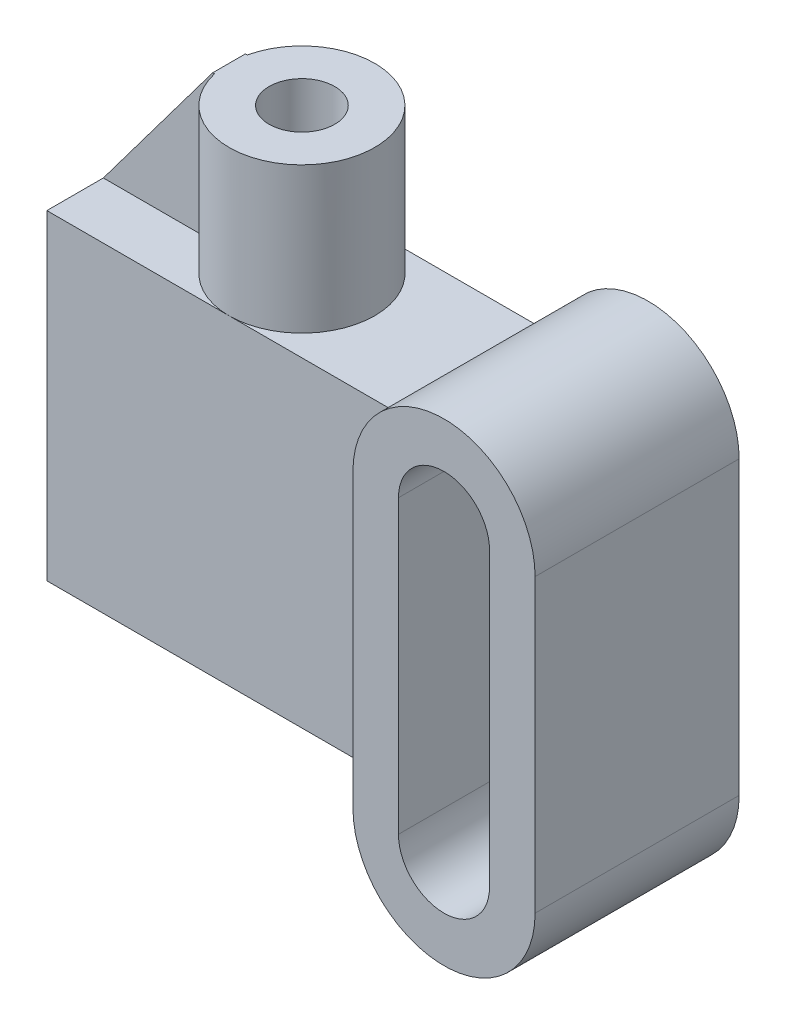
ISO-10303-21;
HEADER;
FILE_DESCRIPTION(('STEP AP214'),'2;1');
FILE_NAME('part.step','',(''),(''),'','','');
FILE_SCHEMA(('AUTOMOTIVE_DESIGN { 1 0 10303 214 1 1 1 1 }'));
ENDSEC;
DATA;
#1=APPLICATION_CONTEXT('core data for automotive mechanical design processes');
#2=APPLICATION_PROTOCOL_DEFINITION('international standard','automotive_design',2000,#1);
#3=PRODUCT_CONTEXT('',#1,'mechanical');
#4=PRODUCT('Part','Part','',(#3));
#5=PRODUCT_RELATED_PRODUCT_CATEGORY('part','',(#4));
#6=PRODUCT_DEFINITION_FORMATION('','',#4);
#7=PRODUCT_DEFINITION_CONTEXT('part definition',#1,'design');
#8=PRODUCT_DEFINITION('design','',#6,#7);
#9=PRODUCT_DEFINITION_SHAPE('','',#8);
#10=(LENGTH_UNIT() NAMED_UNIT(*) SI_UNIT(.MILLI.,.METRE.));
#11=(NAMED_UNIT(*) PLANE_ANGLE_UNIT() SI_UNIT($,.RADIAN.));
#12=(NAMED_UNIT(*) SI_UNIT($,.STERADIAN.) SOLID_ANGLE_UNIT());
#13=UNCERTAINTY_MEASURE_WITH_UNIT(LENGTH_MEASURE(1.E-05),#10,'distance_accuracy_value','');
#14=(GEOMETRIC_REPRESENTATION_CONTEXT(3) GLOBAL_UNCERTAINTY_ASSIGNED_CONTEXT((#13)) GLOBAL_UNIT_ASSIGNED_CONTEXT((#10,
#11,#12)) REPRESENTATION_CONTEXT('',''));
#15=CARTESIAN_POINT('',(0.,0.,0.));
#16=DIRECTION('',(0.,0.,1.));
#17=DIRECTION('',(1.,0.,0.));
#18=AXIS2_PLACEMENT_3D('',#15,#16,#17);
#19=CARTESIAN_POINT('',(-125.,44.,0.));
#20=DIRECTION('',(0.,-1.,0.));
#21=DIRECTION('',(0.,0.,-1.));
#22=AXIS2_PLACEMENT_3D('',#19,#20,#21);
#23=PLANE('',#22);
#24=DIRECTION('',(-1.,0.,0.));
#25=VECTOR('',#24,1.);
#26=CARTESIAN_POINT('',(-125.,44.,15.5));
#27=LINE('',#26,#25);
#28=CARTESIAN_POINT('',(-94.4871752699051,44.,15.5));
#29=VERTEX_POINT('',#28);
#30=CARTESIAN_POINT('',(-125.,44.,15.5));
#31=VERTEX_POINT('',#30);
#32=EDGE_CURVE('E221',#29,#31,#27,.T.);
#33=ORIENTED_EDGE('',*,*,#32,.F.);
#34=CARTESIAN_POINT('',(-75.,44.,20.));
#35=DIRECTION('',(0.,-1.,0.));
#36=DIRECTION('',(0.,0.,-1.));
#37=AXIS2_PLACEMENT_3D('',#34,#35,#36);
#38=CIRCLE('',#37,20.);
#39=CARTESIAN_POINT('',(-75.,44.,0.));
#40=VERTEX_POINT('',#39);
#41=EDGE_CURVE('E11',#40,#29,#38,.F.);
#42=ORIENTED_EDGE('',*,*,#41,.F.);
#43=DIRECTION('',(1.,0.,0.));
#44=VECTOR('',#43,1.);
#45=CARTESIAN_POINT('',(-125.,44.,0.));
#46=LINE('',#45,#44);
#47=CARTESIAN_POINT('',(-125.,44.,0.));
#48=VERTEX_POINT('',#47);
#49=EDGE_CURVE('E353',#48,#40,#46,.T.);
#50=ORIENTED_EDGE('',*,*,#49,.F.);
#51=DIRECTION('',(0.,0.,-1.));
#52=VECTOR('',#51,1.);
#53=CARTESIAN_POINT('',(-125.,44.,0.));
#54=LINE('',#53,#52);
#55=EDGE_CURVE('E305',#31,#48,#54,.T.);
#56=ORIENTED_EDGE('',*,*,#55,.F.);
#57=EDGE_LOOP('',(#33,#42,#50,#56));
#58=FACE_BOUND('',#57,.T.);
#59=ADVANCED_FACE('F43',(#58),#23,.F.);
#60=CARTESIAN_POINT('',(-94.4871752699051,44.,24.5));
#61=VERTEX_POINT('',#60);
#62=CARTESIAN_POINT('',(-75.,44.,40.));
#63=VERTEX_POINT('',#62);
#64=EDGE_CURVE('E52',#61,#63,#38,.F.);
#65=ORIENTED_EDGE('',*,*,#64,.F.);
#66=DIRECTION('',(-1.,0.,0.));
#67=VECTOR('',#66,1.);
#68=CARTESIAN_POINT('',(-125.,44.,24.5));
#69=LINE('',#68,#67);
#70=CARTESIAN_POINT('',(-125.,44.,24.5));
#71=VERTEX_POINT('',#70);
#72=EDGE_CURVE('E249',#61,#71,#69,.T.);
#73=ORIENTED_EDGE('',*,*,#72,.T.);
#74=CARTESIAN_POINT('',(-125.,44.,40.));
#75=VERTEX_POINT('',#74);
#76=EDGE_CURVE('E306',#75,#71,#54,.T.);
#77=ORIENTED_EDGE('',*,*,#76,.F.);
#78=DIRECTION('',(1.,0.,0.));
#79=VECTOR('',#78,1.);
#80=CARTESIAN_POINT('',(-125.,44.,40.));
#81=LINE('',#80,#79);
#82=EDGE_CURVE('E358',#75,#63,#81,.T.);
#83=ORIENTED_EDGE('',*,*,#82,.T.);
#84=EDGE_LOOP('',(#65,#73,#77,#83));
#85=FACE_BOUND('',#84,.T.);
#86=ADVANCED_FACE('F559',(#85),#23,.F.);
#87=CARTESIAN_POINT('',(0.,40.,56.));
#88=DIRECTION('',(0.,0.,-1.));
#89=DIRECTION('',(-1.,0.,0.));
#90=AXIS2_PLACEMENT_3D('',#87,#88,#89);
#91=CYLINDRICAL_SURFACE('',#90,25.);
#92=DIRECTION('',(0.,0.,-1.));
#93=VECTOR('',#92,1.);
#94=CARTESIAN_POINT('',(25.,40.,56.));
#95=LINE('',#94,#93);
#96=CARTESIAN_POINT('',(25.,40.,56.));
#97=VERTEX_POINT('',#96);
#98=CARTESIAN_POINT('',(25.,40.,0.));
#99=VERTEX_POINT('',#98);
#100=EDGE_CURVE('E450',#97,#99,#95,.T.);
#101=ORIENTED_EDGE('',*,*,#100,.T.);
#102=CARTESIAN_POINT('',(0.,40.,0.));
#103=DIRECTION('',(0.,0.,1.));
#104=DIRECTION('',(1.,0.,0.));
#105=AXIS2_PLACEMENT_3D('',#102,#103,#104);
#106=CIRCLE('',#105,25.);
#107=CARTESIAN_POINT('',(-24.6779253585061,44.,0.));
#108=VERTEX_POINT('',#107);
#109=EDGE_CURVE('E435',#99,#108,#106,.T.);
#110=ORIENTED_EDGE('',*,*,#109,.T.);
#111=DIRECTION('',(0.,0.,-1.));
#112=VECTOR('',#111,1.);
#113=CARTESIAN_POINT('',(-24.6779253585061,44.,56.));
#114=LINE('',#113,#112);
#115=CARTESIAN_POINT('',(-24.6779253585061,44.,40.));
#116=VERTEX_POINT('',#115);
#117=EDGE_CURVE('E269',#116,#108,#114,.T.);
#118=ORIENTED_EDGE('',*,*,#117,.F.);
#119=CARTESIAN_POINT('',(0.,40.,40.));
#120=DIRECTION('',(0.,0.,1.));
#121=DIRECTION('',(0.,-1.,0.));
#122=AXIS2_PLACEMENT_3D('',#119,#120,#121);
#123=CIRCLE('',#122,25.);
#124=CARTESIAN_POINT('',(-25.,40.,40.));
#125=VERTEX_POINT('',#124);
#126=EDGE_CURVE('E268',#125,#116,#123,.F.);
#127=ORIENTED_EDGE('',*,*,#126,.F.);
#128=DIRECTION('',(0.,0.,-1.));
#129=VECTOR('',#128,1.);
#130=CARTESIAN_POINT('',(-25.,40.,56.));
#131=LINE('',#130,#129);
#132=CARTESIAN_POINT('',(-25.,40.,56.));
#133=VERTEX_POINT('',#132);
#134=EDGE_CURVE('E471',#133,#125,#131,.T.);
#135=ORIENTED_EDGE('',*,*,#134,.F.);
#136=CARTESIAN_POINT('',(0.,40.,56.));
#137=DIRECTION('',(0.,0.,1.));
#138=DIRECTION('',(1.,0.,0.));
#139=AXIS2_PLACEMENT_3D('',#136,#137,#138);
#140=CIRCLE('',#139,25.);
#141=EDGE_CURVE('E436',#97,#133,#140,.T.);
#142=ORIENTED_EDGE('',*,*,#141,.F.);
#143=EDGE_LOOP('',(#101,#110,#118,#127,#135,#142));
#144=FACE_BOUND('',#143,.T.);
#145=ADVANCED_FACE('F45',(#144),#91,.T.);
#146=CARTESIAN_POINT('',(-25.,40.,56.));
#147=DIRECTION('',(1.,0.,0.));
#148=DIRECTION('',(0.,0.,-1.));
#149=AXIS2_PLACEMENT_3D('',#146,#147,#148);
#150=PLANE('',#149);
#151=DIRECTION('',(0.,1.,0.));
#152=VECTOR('',#151,1.);
#153=CARTESIAN_POINT('',(-25.,44.,40.));
#154=LINE('',#153,#152);
#155=CARTESIAN_POINT('',(-25.,-40.,40.));
#156=VERTEX_POINT('',#155);
#157=EDGE_CURVE('E338',#156,#125,#154,.T.);
#158=ORIENTED_EDGE('',*,*,#157,.F.);
#159=DIRECTION('',(0.,0.,-1.));
#160=VECTOR('',#159,1.);
#161=CARTESIAN_POINT('',(-25.,-40.,56.));
#162=LINE('',#161,#160);
#163=CARTESIAN_POINT('',(-25.,-40.,56.));
#164=VERTEX_POINT('',#163);
#165=EDGE_CURVE('E469',#164,#156,#162,.T.);
#166=ORIENTED_EDGE('',*,*,#165,.F.);
#167=DIRECTION('',(0.,-1.,0.));
#168=VECTOR('',#167,1.);
#169=CARTESIAN_POINT('',(-25.,40.,56.));
#170=LINE('',#169,#168);
#171=EDGE_CURVE('E440',#133,#164,#170,.T.);
#172=ORIENTED_EDGE('',*,*,#171,.F.);
#173=ORIENTED_EDGE('',*,*,#134,.T.);
#174=EDGE_LOOP('',(#158,#166,#172,#173));
#175=FACE_BOUND('',#174,.T.);
#176=ADVANCED_FACE('F478',(#175),#150,.F.);
#177=DIRECTION('',(0.,-1.,0.));
#178=VECTOR('',#177,1.);
#179=CARTESIAN_POINT('',(-25.,32.,28.));
#180=LINE('',#179,#178);
#181=CARTESIAN_POINT('',(-25.,32.,28.));
#182=VERTEX_POINT('',#181);
#183=CARTESIAN_POINT('',(-25.,-32.,28.));
#184=VERTEX_POINT('',#183);
#185=EDGE_CURVE('E323',#182,#184,#180,.T.);
#186=ORIENTED_EDGE('',*,*,#185,.F.);
#187=DIRECTION('',(0.,0.,1.));
#188=VECTOR('',#187,1.);
#189=CARTESIAN_POINT('',(-25.,32.,12.));
#190=LINE('',#189,#188);
#191=CARTESIAN_POINT('',(-25.,32.,12.));
#192=VERTEX_POINT('',#191);
#193=EDGE_CURVE('E320',#192,#182,#190,.T.);
#194=ORIENTED_EDGE('',*,*,#193,.F.);
#195=DIRECTION('',(0.,1.,0.));
#196=VECTOR('',#195,1.);
#197=CARTESIAN_POINT('',(-25.,22.,12.));
#198=LINE('',#197,#196);
#199=CARTESIAN_POINT('',(-25.,22.,12.));
#200=VERTEX_POINT('',#199);
#201=EDGE_CURVE('E272',#200,#192,#198,.T.);
#202=ORIENTED_EDGE('',*,*,#201,.F.);
#203=DIRECTION('',(0.,0.,1.));
#204=VECTOR('',#203,1.);
#205=CARTESIAN_POINT('',(-25.,22.,12.));
#206=LINE('',#205,#204);
#207=CARTESIAN_POINT('',(-25.,22.,0.));
#208=VERTEX_POINT('',#207);
#209=EDGE_CURVE('E281',#208,#200,#206,.T.);
#210=ORIENTED_EDGE('',*,*,#209,.F.);
#211=DIRECTION('',(0.,-1.,0.));
#212=VECTOR('',#211,1.);
#213=CARTESIAN_POINT('',(-25.,40.,0.));
#214=LINE('',#213,#212);
#215=CARTESIAN_POINT('',(-25.,-22.,0.));
#216=VERTEX_POINT('',#215);
#217=EDGE_CURVE('E454',#208,#216,#214,.T.);
#218=ORIENTED_EDGE('',*,*,#217,.T.);
#219=DIRECTION('',(0.,0.,-1.));
#220=VECTOR('',#219,1.);
#221=CARTESIAN_POINT('',(-25.,-22.,0.));
#222=LINE('',#221,#220);
#223=CARTESIAN_POINT('',(-25.,-22.,12.));
#224=VERTEX_POINT('',#223);
#225=EDGE_CURVE('E334',#224,#216,#222,.T.);
#226=ORIENTED_EDGE('',*,*,#225,.F.);
#227=DIRECTION('',(0.,1.,0.));
#228=VECTOR('',#227,1.);
#229=CARTESIAN_POINT('',(-25.,-32.,12.));
#230=LINE('',#229,#228);
#231=CARTESIAN_POINT('',(-25.,-32.,12.));
#232=VERTEX_POINT('',#231);
#233=EDGE_CURVE('E330',#232,#224,#230,.T.);
#234=ORIENTED_EDGE('',*,*,#233,.F.);
#235=DIRECTION('',(0.,0.,-1.));
#236=VECTOR('',#235,1.);
#237=CARTESIAN_POINT('',(-25.,-32.,28.));
#238=LINE('',#237,#236);
#239=EDGE_CURVE('E327',#184,#232,#238,.T.);
#240=ORIENTED_EDGE('',*,*,#239,.F.);
#241=EDGE_LOOP('',(#186,#194,#202,#210,#218,#226,#234,#240));
#242=FACE_BOUND('',#241,.T.);
#243=ADVANCED_FACE('F758',(#242),#150,.F.);
#244=CARTESIAN_POINT('',(0.,-40.,56.));
#245=DIRECTION('',(0.,0.,-1.));
#246=DIRECTION('',(-1.,0.,0.));
#247=AXIS2_PLACEMENT_3D('',#244,#245,#246);
#248=CYLINDRICAL_SURFACE('',#247,25.);
#249=CARTESIAN_POINT('',(0.,-40.,40.));
#250=DIRECTION('',(0.,0.,1.));
#251=DIRECTION('',(0.,-1.,0.));
#252=AXIS2_PLACEMENT_3D('',#249,#250,#251);
#253=CIRCLE('',#252,25.);
#254=CARTESIAN_POINT('',(-24.6779253585061,-44.,40.));
#255=VERTEX_POINT('',#254);
#256=EDGE_CURVE('E259',#255,#156,#253,.F.);
#257=ORIENTED_EDGE('',*,*,#256,.F.);
#258=DIRECTION('',(0.,0.,-1.));
#259=VECTOR('',#258,1.);
#260=CARTESIAN_POINT('',(-24.6779253585061,-44.,56.));
#261=LINE('',#260,#259);
#262=CARTESIAN_POINT('',(-24.6779253585061,-44.,0.));
#263=VERTEX_POINT('',#262);
#264=EDGE_CURVE('E265',#263,#255,#261,.F.);
#265=ORIENTED_EDGE('',*,*,#264,.F.);
#266=CARTESIAN_POINT('',(0.,-40.,0.));
#267=DIRECTION('',(0.,0.,1.));
#268=DIRECTION('',(1.,0.,0.));
#269=AXIS2_PLACEMENT_3D('',#266,#267,#268);
#270=CIRCLE('',#269,25.);
#271=CARTESIAN_POINT('',(25.,-40.,0.));
#272=VERTEX_POINT('',#271);
#273=EDGE_CURVE('E457',#263,#272,#270,.T.);
#274=ORIENTED_EDGE('',*,*,#273,.T.);
#275=DIRECTION('',(0.,0.,-1.));
#276=VECTOR('',#275,1.);
#277=CARTESIAN_POINT('',(25.,-40.,56.));
#278=LINE('',#277,#276);
#279=CARTESIAN_POINT('',(25.,-40.,56.));
#280=VERTEX_POINT('',#279);
#281=EDGE_CURVE('E466',#280,#272,#278,.T.);
#282=ORIENTED_EDGE('',*,*,#281,.F.);
#283=CARTESIAN_POINT('',(0.,-40.,56.));
#284=DIRECTION('',(0.,0.,1.));
#285=DIRECTION('',(1.,0.,0.));
#286=AXIS2_PLACEMENT_3D('',#283,#284,#285);
#287=CIRCLE('',#286,25.);
#288=EDGE_CURVE('E444',#164,#280,#287,.T.);
#289=ORIENTED_EDGE('',*,*,#288,.F.);
#290=ORIENTED_EDGE('',*,*,#165,.T.);
#291=EDGE_LOOP('',(#257,#265,#274,#282,#289,#290));
#292=FACE_BOUND('',#291,.T.);
#293=ADVANCED_FACE('F489',(#292),#248,.T.);
#294=CARTESIAN_POINT('',(0.,40.,56.));
#295=DIRECTION('',(0.,0.,1.));
#296=DIRECTION('',(1.,0.,0.));
#297=AXIS2_PLACEMENT_3D('',#294,#295,#296);
#298=PLANE('',#297);
#299=ORIENTED_EDGE('',*,*,#141,.T.);
#300=ORIENTED_EDGE('',*,*,#171,.T.);
#301=ORIENTED_EDGE('',*,*,#288,.T.);
#302=DIRECTION('',(0.,1.,0.));
#303=VECTOR('',#302,1.);
#304=CARTESIAN_POINT('',(25.,40.,56.));
#305=LINE('',#304,#303);
#306=EDGE_CURVE('E447',#280,#97,#305,.T.);
#307=ORIENTED_EDGE('',*,*,#306,.T.);
#308=EDGE_LOOP('',(#299,#300,#301,#307));
#309=FACE_BOUND('',#308,.T.);
#310=DIRECTION('',(0.,-1.,0.));
#311=VECTOR('',#310,1.);
#312=CARTESIAN_POINT('',(-12.5,40.,56.));
#313=LINE('',#312,#311);
#314=CARTESIAN_POINT('',(-12.5,40.,56.));
#315=VERTEX_POINT('',#314);
#316=CARTESIAN_POINT('',(-12.5,-40.,56.));
#317=VERTEX_POINT('',#316);
#318=EDGE_CURVE('E398',#315,#317,#313,.T.);
#319=ORIENTED_EDGE('',*,*,#318,.F.);
#320=CARTESIAN_POINT('',(0.,40.,56.));
#321=DIRECTION('',(0.,0.,1.));
#322=DIRECTION('',(1.,0.,0.));
#323=AXIS2_PLACEMENT_3D('',#320,#321,#322);
#324=CIRCLE('',#323,12.5);
#325=CARTESIAN_POINT('',(12.5,40.,56.));
#326=VERTEX_POINT('',#325);
#327=EDGE_CURVE('E395',#326,#315,#324,.T.);
#328=ORIENTED_EDGE('',*,*,#327,.F.);
#329=DIRECTION('',(0.,1.,0.));
#330=VECTOR('',#329,1.);
#331=CARTESIAN_POINT('',(12.5,40.,56.));
#332=LINE('',#331,#330);
#333=CARTESIAN_POINT('',(12.5,-40.,56.));
#334=VERTEX_POINT('',#333);
#335=EDGE_CURVE('E406',#334,#326,#332,.T.);
#336=ORIENTED_EDGE('',*,*,#335,.F.);
#337=CARTESIAN_POINT('',(0.,-40.,56.));
#338=DIRECTION('',(0.,0.,1.));
#339=DIRECTION('',(1.,0.,0.));
#340=AXIS2_PLACEMENT_3D('',#337,#338,#339);
#341=CIRCLE('',#340,12.5);
#342=EDGE_CURVE('E402',#317,#334,#341,.T.);
#343=ORIENTED_EDGE('',*,*,#342,.F.);
#344=EDGE_LOOP('',(#319,#328,#336,#343));
#345=FACE_BOUND('',#344,.T.);
#346=ADVANCED_FACE('F495',(#309,#345),#298,.T.);
#347=CARTESIAN_POINT('',(0.,40.,0.));
#348=DIRECTION('',(0.,0.,1.));
#349=DIRECTION('',(1.,0.,0.));
#350=AXIS2_PLACEMENT_3D('',#347,#348,#349);
#351=PLANE('',#350);
#352=ORIENTED_EDGE('',*,*,#109,.F.);
#353=DIRECTION('',(0.,1.,0.));
#354=VECTOR('',#353,1.);
#355=CARTESIAN_POINT('',(25.,40.,0.));
#356=LINE('',#355,#354);
#357=EDGE_CURVE('E441',#272,#99,#356,.T.);
#358=ORIENTED_EDGE('',*,*,#357,.F.);
#359=ORIENTED_EDGE('',*,*,#273,.F.);
#360=DIRECTION('',(1.,0.,0.));
#361=VECTOR('',#360,1.);
#362=CARTESIAN_POINT('',(-125.,-44.,0.));
#363=LINE('',#362,#361);
#364=CARTESIAN_POINT('',(-125.,-44.,0.));
#365=VERTEX_POINT('',#364);
#366=EDGE_CURVE('E366',#365,#263,#363,.T.);
#367=ORIENTED_EDGE('',*,*,#366,.F.);
#368=DIRECTION('',(0.,-1.,0.));
#369=VECTOR('',#368,1.);
#370=CARTESIAN_POINT('',(-125.,-44.,0.));
#371=LINE('',#370,#369);
#372=CARTESIAN_POINT('',(-125.,-22.,0.));
#373=VERTEX_POINT('',#372);
#374=EDGE_CURVE('E296',#373,#365,#371,.T.);
#375=ORIENTED_EDGE('',*,*,#374,.F.);
#376=DIRECTION('',(1.,0.,0.));
#377=VECTOR('',#376,1.);
#378=CARTESIAN_POINT('',(-125.,-22.,0.));
#379=LINE('',#378,#377);
#380=EDGE_CURVE('E370',#373,#216,#379,.T.);
#381=ORIENTED_EDGE('',*,*,#380,.T.);
#382=ORIENTED_EDGE('',*,*,#217,.F.);
#383=DIRECTION('',(1.,0.,0.));
#384=VECTOR('',#383,1.);
#385=CARTESIAN_POINT('',(-125.,22.,0.));
#386=LINE('',#385,#384);
#387=CARTESIAN_POINT('',(-125.,22.,0.));
#388=VERTEX_POINT('',#387);
#389=EDGE_CURVE('E348',#388,#208,#386,.T.);
#390=ORIENTED_EDGE('',*,*,#389,.F.);
#391=DIRECTION('',(0.,-1.,0.));
#392=VECTOR('',#391,1.);
#393=CARTESIAN_POINT('',(-125.,22.,0.));
#394=LINE('',#393,#392);
#395=EDGE_CURVE('E310',#48,#388,#394,.T.);
#396=ORIENTED_EDGE('',*,*,#395,.F.);
#397=ORIENTED_EDGE('',*,*,#49,.T.);
#398=EDGE_CURVE('E352',#40,#108,#46,.T.);
#399=ORIENTED_EDGE('',*,*,#398,.T.);
#400=EDGE_LOOP('',(#352,#358,#359,#367,#375,#381,#382,#390,#396,#397,#399));
#401=FACE_BOUND('',#400,.T.);
#402=CARTESIAN_POINT('',(0.,40.,0.));
#403=DIRECTION('',(0.,0.,1.));
#404=DIRECTION('',(1.,0.,0.));
#405=AXIS2_PLACEMENT_3D('',#402,#403,#404);
#406=CIRCLE('',#405,12.5);
#407=CARTESIAN_POINT('',(12.5,40.,0.));
#408=VERTEX_POINT('',#407);
#409=CARTESIAN_POINT('',(-12.5,40.,0.));
#410=VERTEX_POINT('',#409);
#411=EDGE_CURVE('E394',#408,#410,#406,.T.);
#412=ORIENTED_EDGE('',*,*,#411,.T.);
#413=DIRECTION('',(0.,-1.,0.));
#414=VECTOR('',#413,1.);
#415=CARTESIAN_POINT('',(-12.5,40.,0.));
#416=LINE('',#415,#414);
#417=CARTESIAN_POINT('',(-12.5,-40.,0.));
#418=VERTEX_POINT('',#417);
#419=EDGE_CURVE('E413',#410,#418,#416,.T.);
#420=ORIENTED_EDGE('',*,*,#419,.T.);
#421=CARTESIAN_POINT('',(0.,-40.,0.));
#422=DIRECTION('',(0.,0.,1.));
#423=DIRECTION('',(1.,0.,0.));
#424=AXIS2_PLACEMENT_3D('',#421,#422,#423);
#425=CIRCLE('',#424,12.5);
#426=CARTESIAN_POINT('',(12.5,-40.,0.));
#427=VERTEX_POINT('',#426);
#428=EDGE_CURVE('E417',#418,#427,#425,.T.);
#429=ORIENTED_EDGE('',*,*,#428,.T.);
#430=DIRECTION('',(0.,1.,0.));
#431=VECTOR('',#430,1.);
#432=CARTESIAN_POINT('',(12.5,40.,0.));
#433=LINE('',#432,#431);
#434=EDGE_CURVE('E399',#427,#408,#433,.T.);
#435=ORIENTED_EDGE('',*,*,#434,.T.);
#436=EDGE_LOOP('',(#412,#420,#429,#435));
#437=FACE_BOUND('',#436,.T.);
#438=ADVANCED_FACE('F505',(#401,#437),#351,.F.);
#439=CARTESIAN_POINT('',(25.,40.,56.));
#440=DIRECTION('',(-1.,0.,0.));
#441=DIRECTION('',(0.,0.,1.));
#442=AXIS2_PLACEMENT_3D('',#439,#440,#441);
#443=PLANE('',#442);
#444=ORIENTED_EDGE('',*,*,#281,.T.);
#445=ORIENTED_EDGE('',*,*,#357,.T.);
#446=ORIENTED_EDGE('',*,*,#100,.F.);
#447=ORIENTED_EDGE('',*,*,#306,.F.);
#448=EDGE_LOOP('',(#444,#445,#446,#447));
#449=FACE_BOUND('',#448,.T.);
#450=ADVANCED_FACE('F502',(#449),#443,.F.);
#451=CARTESIAN_POINT('',(0.,40.,56.));
#452=DIRECTION('',(0.,0.,-1.));
#453=DIRECTION('',(-1.,0.,0.));
#454=AXIS2_PLACEMENT_3D('',#451,#452,#453);
#455=CYLINDRICAL_SURFACE('',#454,12.5);
#456=DIRECTION('',(0.,0.,-1.));
#457=VECTOR('',#456,1.);
#458=CARTESIAN_POINT('',(-12.5,40.,56.));
#459=LINE('',#458,#457);
#460=EDGE_CURVE('E432',#315,#410,#459,.T.);
#461=ORIENTED_EDGE('',*,*,#460,.T.);
#462=ORIENTED_EDGE('',*,*,#411,.F.);
#463=DIRECTION('',(0.,0.,-1.));
#464=VECTOR('',#463,1.);
#465=CARTESIAN_POINT('',(12.5,40.,56.));
#466=LINE('',#465,#464);
#467=EDGE_CURVE('E409',#326,#408,#466,.T.);
#468=ORIENTED_EDGE('',*,*,#467,.F.);
#469=ORIENTED_EDGE('',*,*,#327,.T.);
#470=EDGE_LOOP('',(#461,#462,#468,#469));
#471=FACE_BOUND('',#470,.T.);
#472=ADVANCED_FACE('F726',(#471),#455,.F.);
#473=CARTESIAN_POINT('',(-12.5,40.,56.));
#474=DIRECTION('',(1.,0.,0.));
#475=DIRECTION('',(0.,0.,-1.));
#476=AXIS2_PLACEMENT_3D('',#473,#474,#475);
#477=PLANE('',#476);
#478=DIRECTION('',(0.,0.,-1.));
#479=VECTOR('',#478,1.);
#480=CARTESIAN_POINT('',(-12.5,-40.,56.));
#481=LINE('',#480,#479);
#482=EDGE_CURVE('E429',#317,#418,#481,.T.);
#483=ORIENTED_EDGE('',*,*,#482,.T.);
#484=ORIENTED_EDGE('',*,*,#419,.F.);
#485=ORIENTED_EDGE('',*,*,#460,.F.);
#486=ORIENTED_EDGE('',*,*,#318,.T.);
#487=EDGE_LOOP('',(#483,#484,#485,#486));
#488=FACE_BOUND('',#487,.T.);
#489=ADVANCED_FACE('F715',(#488),#477,.T.);
#490=CARTESIAN_POINT('',(0.,-40.,56.));
#491=DIRECTION('',(0.,0.,-1.));
#492=DIRECTION('',(-1.,0.,0.));
#493=AXIS2_PLACEMENT_3D('',#490,#491,#492);
#494=CYLINDRICAL_SURFACE('',#493,12.5);
#495=DIRECTION('',(0.,0.,-1.));
#496=VECTOR('',#495,1.);
#497=CARTESIAN_POINT('',(12.5,-40.,56.));
#498=LINE('',#497,#496);
#499=EDGE_CURVE('E426',#334,#427,#498,.T.);
#500=ORIENTED_EDGE('',*,*,#499,.T.);
#501=ORIENTED_EDGE('',*,*,#428,.F.);
#502=ORIENTED_EDGE('',*,*,#482,.F.);
#503=ORIENTED_EDGE('',*,*,#342,.T.);
#504=EDGE_LOOP('',(#500,#501,#502,#503));
#505=FACE_BOUND('',#504,.T.);
#506=ADVANCED_FACE('F703',(#505),#494,.F.);
#507=CARTESIAN_POINT('',(12.5,40.,56.));
#508=DIRECTION('',(-1.,0.,0.));
#509=DIRECTION('',(0.,0.,1.));
#510=AXIS2_PLACEMENT_3D('',#507,#508,#509);
#511=PLANE('',#510);
#512=ORIENTED_EDGE('',*,*,#467,.T.);
#513=ORIENTED_EDGE('',*,*,#434,.F.);
#514=ORIENTED_EDGE('',*,*,#499,.F.);
#515=ORIENTED_EDGE('',*,*,#335,.T.);
#516=EDGE_LOOP('',(#512,#513,#514,#515));
#517=FACE_BOUND('',#516,.T.);
#518=ADVANCED_FACE('F698',(#517),#511,.T.);
#519=CARTESIAN_POINT('',(-125.,22.,12.));
#520=DIRECTION('',(0.,0.,-1.));
#521=DIRECTION('',(0.,1.,0.));
#522=AXIS2_PLACEMENT_3D('',#519,#520,#521);
#523=PLANE('',#522);
#524=ORIENTED_EDGE('',*,*,#201,.T.);
#525=DIRECTION('',(1.,0.,0.));
#526=VECTOR('',#525,1.);
#527=CARTESIAN_POINT('',(-125.,32.,12.));
#528=LINE('',#527,#526);
#529=CARTESIAN_POINT('',(-125.,32.,12.));
#530=VERTEX_POINT('',#529);
#531=EDGE_CURVE('E390',#530,#192,#528,.T.);
#532=ORIENTED_EDGE('',*,*,#531,.F.);
#533=DIRECTION('',(0.,1.,0.));
#534=VECTOR('',#533,1.);
#535=CARTESIAN_POINT('',(-125.,22.,12.));
#536=LINE('',#535,#534);
#537=CARTESIAN_POINT('',(-125.,22.,12.));
#538=VERTEX_POINT('',#537);
#539=EDGE_CURVE('E276',#538,#530,#536,.T.);
#540=ORIENTED_EDGE('',*,*,#539,.F.);
#541=DIRECTION('',(1.,0.,0.));
#542=VECTOR('',#541,1.);
#543=CARTESIAN_POINT('',(-125.,22.,12.));
#544=LINE('',#543,#542);
#545=EDGE_CURVE('E316',#538,#200,#544,.T.);
#546=ORIENTED_EDGE('',*,*,#545,.T.);
#547=EDGE_LOOP('',(#524,#532,#540,#546));
#548=FACE_BOUND('',#547,.T.);
#549=ADVANCED_FACE('F530',(#548),#523,.F.);
#550=CARTESIAN_POINT('',(-125.,32.,12.));
#551=DIRECTION('',(0.,1.,0.));
#552=DIRECTION('',(0.,0.,1.));
#553=AXIS2_PLACEMENT_3D('',#550,#551,#552);
#554=PLANE('',#553);
#555=DIRECTION('',(1.,0.,0.));
#556=VECTOR('',#555,1.);
#557=CARTESIAN_POINT('',(-125.,32.,28.));
#558=LINE('',#557,#556);
#559=CARTESIAN_POINT('',(-125.,32.,28.));
#560=VERTEX_POINT('',#559);
#561=EDGE_CURVE('E386',#560,#182,#558,.T.);
#562=ORIENTED_EDGE('',*,*,#561,.F.);
#563=DIRECTION('',(0.,0.,1.));
#564=VECTOR('',#563,1.);
#565=CARTESIAN_POINT('',(-125.,32.,12.));
#566=LINE('',#565,#564);
#567=EDGE_CURVE('E280',#530,#560,#566,.T.);
#568=ORIENTED_EDGE('',*,*,#567,.F.);
#569=ORIENTED_EDGE('',*,*,#531,.T.);
#570=ORIENTED_EDGE('',*,*,#193,.T.);
#571=EDGE_LOOP('',(#562,#568,#569,#570));
#572=FACE_BOUND('',#571,.T.);
#573=ADVANCED_FACE('F532',(#572),#554,.F.);
#574=CARTESIAN_POINT('',(-125.,32.,28.));
#575=DIRECTION('',(0.,0.,1.));
#576=DIRECTION('',(0.,-1.,0.));
#577=AXIS2_PLACEMENT_3D('',#574,#575,#576);
#578=PLANE('',#577);
#579=ORIENTED_EDGE('',*,*,#185,.T.);
#580=DIRECTION('',(1.,0.,0.));
#581=VECTOR('',#580,1.);
#582=CARTESIAN_POINT('',(-125.,-32.,28.));
#583=LINE('',#582,#581);
#584=CARTESIAN_POINT('',(-125.,-32.,28.));
#585=VERTEX_POINT('',#584);
#586=EDGE_CURVE('E382',#585,#184,#583,.T.);
#587=ORIENTED_EDGE('',*,*,#586,.F.);
#588=DIRECTION('',(0.,-1.,0.));
#589=VECTOR('',#588,1.);
#590=CARTESIAN_POINT('',(-125.,32.,28.));
#591=LINE('',#590,#589);
#592=EDGE_CURVE('E284',#560,#585,#591,.T.);
#593=ORIENTED_EDGE('',*,*,#592,.F.);
#594=ORIENTED_EDGE('',*,*,#561,.T.);
#595=EDGE_LOOP('',(#579,#587,#593,#594));
#596=FACE_BOUND('',#595,.T.);
#597=ADVANCED_FACE('F537',(#596),#578,.F.);
#598=CARTESIAN_POINT('',(-125.,-32.,28.));
#599=DIRECTION('',(0.,-1.,0.));
#600=DIRECTION('',(0.,0.,-1.));
#601=AXIS2_PLACEMENT_3D('',#598,#599,#600);
#602=PLANE('',#601);
#603=ORIENTED_EDGE('',*,*,#239,.T.);
#604=DIRECTION('',(1.,0.,0.));
#605=VECTOR('',#604,1.);
#606=CARTESIAN_POINT('',(-125.,-32.,12.));
#607=LINE('',#606,#605);
#608=CARTESIAN_POINT('',(-125.,-32.,12.));
#609=VERTEX_POINT('',#608);
#610=EDGE_CURVE('E378',#609,#232,#607,.T.);
#611=ORIENTED_EDGE('',*,*,#610,.F.);
#612=DIRECTION('',(0.,0.,-1.));
#613=VECTOR('',#612,1.);
#614=CARTESIAN_POINT('',(-125.,-32.,28.));
#615=LINE('',#614,#613);
#616=EDGE_CURVE('E287',#585,#609,#615,.T.);
#617=ORIENTED_EDGE('',*,*,#616,.F.);
#618=ORIENTED_EDGE('',*,*,#586,.T.);
#619=EDGE_LOOP('',(#603,#611,#617,#618));
#620=FACE_BOUND('',#619,.T.);
#621=ADVANCED_FACE('F543',(#620),#602,.F.);
#622=CARTESIAN_POINT('',(-125.,-32.,12.));
#623=DIRECTION('',(0.,0.,-1.));
#624=DIRECTION('',(0.,1.,0.));
#625=AXIS2_PLACEMENT_3D('',#622,#623,#624);
#626=PLANE('',#625);
#627=ORIENTED_EDGE('',*,*,#233,.T.);
#628=DIRECTION('',(1.,0.,0.));
#629=VECTOR('',#628,1.);
#630=CARTESIAN_POINT('',(-125.,-22.,12.));
#631=LINE('',#630,#629);
#632=CARTESIAN_POINT('',(-125.,-22.,12.));
#633=VERTEX_POINT('',#632);
#634=EDGE_CURVE('E374',#633,#224,#631,.T.);
#635=ORIENTED_EDGE('',*,*,#634,.F.);
#636=DIRECTION('',(0.,1.,0.));
#637=VECTOR('',#636,1.);
#638=CARTESIAN_POINT('',(-125.,-32.,12.));
#639=LINE('',#638,#637);
#640=EDGE_CURVE('E290',#609,#633,#639,.T.);
#641=ORIENTED_EDGE('',*,*,#640,.F.);
#642=ORIENTED_EDGE('',*,*,#610,.T.);
#643=EDGE_LOOP('',(#627,#635,#641,#642));
#644=FACE_BOUND('',#643,.T.);
#645=ADVANCED_FACE('F546',(#644),#626,.F.);
#646=CARTESIAN_POINT('',(-125.,-22.,0.));
#647=DIRECTION('',(0.,-1.,0.));
#648=DIRECTION('',(0.,0.,-1.));
#649=AXIS2_PLACEMENT_3D('',#646,#647,#648);
#650=PLANE('',#649);
#651=ORIENTED_EDGE('',*,*,#225,.T.);
#652=ORIENTED_EDGE('',*,*,#380,.F.);
#653=DIRECTION('',(0.,0.,-1.));
#654=VECTOR('',#653,1.);
#655=CARTESIAN_POINT('',(-125.,-22.,0.));
#656=LINE('',#655,#654);
#657=EDGE_CURVE('E293',#633,#373,#656,.T.);
#658=ORIENTED_EDGE('',*,*,#657,.F.);
#659=ORIENTED_EDGE('',*,*,#634,.T.);
#660=EDGE_LOOP('',(#651,#652,#658,#659));
#661=FACE_BOUND('',#660,.T.);
#662=ADVANCED_FACE('F550',(#661),#650,.F.);
#663=CARTESIAN_POINT('',(-125.,-44.,40.));
#664=DIRECTION('',(0.,1.,0.));
#665=DIRECTION('',(0.,0.,1.));
#666=AXIS2_PLACEMENT_3D('',#663,#664,#665);
#667=PLANE('',#666);
#668=DIRECTION('',(1.,0.,0.));
#669=VECTOR('',#668,1.);
#670=CARTESIAN_POINT('',(-125.,-44.,40.));
#671=LINE('',#670,#669);
#672=CARTESIAN_POINT('',(-125.,-44.,40.));
#673=VERTEX_POINT('',#672);
#674=EDGE_CURVE('E362',#673,#255,#671,.T.);
#675=ORIENTED_EDGE('',*,*,#674,.F.);
#676=DIRECTION('',(0.,0.,1.));
#677=VECTOR('',#676,1.);
#678=CARTESIAN_POINT('',(-125.,-44.,40.));
#679=LINE('',#678,#677);
#680=EDGE_CURVE('E299',#365,#673,#679,.T.);
#681=ORIENTED_EDGE('',*,*,#680,.F.);
#682=ORIENTED_EDGE('',*,*,#366,.T.);
#683=ORIENTED_EDGE('',*,*,#264,.T.);
#684=EDGE_LOOP('',(#675,#681,#682,#683));
#685=FACE_BOUND('',#684,.T.);
#686=ADVANCED_FACE('F555',(#685),#667,.F.);
#687=CARTESIAN_POINT('',(-125.,44.,40.));
#688=DIRECTION('',(0.,0.,-1.));
#689=DIRECTION('',(0.,1.,0.));
#690=AXIS2_PLACEMENT_3D('',#687,#688,#689);
#691=PLANE('',#690);
#692=ORIENTED_EDGE('',*,*,#674,.T.);
#693=ORIENTED_EDGE('',*,*,#256,.T.);
#694=ORIENTED_EDGE('',*,*,#157,.T.);
#695=ORIENTED_EDGE('',*,*,#126,.T.);
#696=EDGE_CURVE('E357',#63,#116,#81,.T.);
#697=ORIENTED_EDGE('',*,*,#696,.F.);
#698=ORIENTED_EDGE('',*,*,#82,.F.);
#699=DIRECTION('',(0.,1.,0.));
#700=VECTOR('',#699,1.);
#701=CARTESIAN_POINT('',(-125.,44.,40.));
#702=LINE('',#701,#700);
#703=EDGE_CURVE('E302',#673,#75,#702,.T.);
#704=ORIENTED_EDGE('',*,*,#703,.F.);
#705=EDGE_LOOP('',(#692,#693,#694,#695,#697,#698,#704));
#706=FACE_BOUND('',#705,.T.);
#707=ADVANCED_FACE('F483',(#706),#691,.F.);
#708=ORIENTED_EDGE('',*,*,#117,.T.);
#709=ORIENTED_EDGE('',*,*,#398,.F.);
#710=CARTESIAN_POINT('',(-75.,44.,20.));
#711=DIRECTION('',(0.,1.,0.));
#712=DIRECTION('',(0.,0.,1.));
#713=AXIS2_PLACEMENT_3D('',#710,#711,#712);
#714=CIRCLE('',#713,20.);
#715=EDGE_CURVE('E256',#63,#40,#714,.T.);
#716=ORIENTED_EDGE('',*,*,#715,.F.);
#717=ORIENTED_EDGE('',*,*,#696,.T.);
#718=EDGE_LOOP('',(#708,#709,#716,#717));
#719=FACE_BOUND('',#718,.T.);
#720=ADVANCED_FACE('F572',(#719),#23,.F.);
#721=CARTESIAN_POINT('',(-125.,22.,12.));
#722=DIRECTION('',(0.,1.,0.));
#723=DIRECTION('',(0.,0.,1.));
#724=AXIS2_PLACEMENT_3D('',#721,#722,#723);
#725=PLANE('',#724);
#726=ORIENTED_EDGE('',*,*,#209,.T.);
#727=ORIENTED_EDGE('',*,*,#545,.F.);
#728=DIRECTION('',(0.,0.,1.));
#729=VECTOR('',#728,1.);
#730=CARTESIAN_POINT('',(-125.,22.,12.));
#731=LINE('',#730,#729);
#732=EDGE_CURVE('E313',#388,#538,#731,.T.);
#733=ORIENTED_EDGE('',*,*,#732,.F.);
#734=ORIENTED_EDGE('',*,*,#389,.T.);
#735=EDGE_LOOP('',(#726,#727,#733,#734));
#736=FACE_BOUND('',#735,.T.);
#737=ADVANCED_FACE('F525',(#736),#725,.F.);
#738=CARTESIAN_POINT('',(-125.,0.,0.));
#739=DIRECTION('',(1.,0.,0.));
#740=DIRECTION('',(0.,0.,-1.));
#741=AXIS2_PLACEMENT_3D('',#738,#739,#740);
#742=PLANE('',#741);
#743=ORIENTED_EDGE('',*,*,#76,.T.);
#744=DIRECTION('',(0.,0.,1.));
#745=VECTOR('',#744,1.);
#746=CARTESIAN_POINT('',(-125.,44.,0.));
#747=LINE('',#746,#745);
#748=EDGE_CURVE('E234',#31,#71,#747,.T.);
#749=ORIENTED_EDGE('',*,*,#748,.F.);
#750=ORIENTED_EDGE('',*,*,#55,.T.);
#751=ORIENTED_EDGE('',*,*,#395,.T.);
#752=ORIENTED_EDGE('',*,*,#732,.T.);
#753=ORIENTED_EDGE('',*,*,#539,.T.);
#754=ORIENTED_EDGE('',*,*,#567,.T.);
#755=ORIENTED_EDGE('',*,*,#592,.T.);
#756=ORIENTED_EDGE('',*,*,#616,.T.);
#757=ORIENTED_EDGE('',*,*,#640,.T.);
#758=ORIENTED_EDGE('',*,*,#657,.T.);
#759=ORIENTED_EDGE('',*,*,#374,.T.);
#760=ORIENTED_EDGE('',*,*,#680,.T.);
#761=ORIENTED_EDGE('',*,*,#703,.T.);
#762=EDGE_LOOP('',(#743,#749,#750,#751,#752,#753,#754,#755,#756,#757,#758,#759,#760,#761));
#763=FACE_BOUND('',#762,.T.);
#764=ADVANCED_FACE('F517',(#763),#742,.F.);
#765=CARTESIAN_POINT('',(-75.,84.,20.));
#766=DIRECTION('',(0.,-1.,0.));
#767=DIRECTION('',(0.,0.,-1.));
#768=AXIS2_PLACEMENT_3D('',#765,#766,#767);
#769=CYLINDRICAL_SURFACE('',#768,20.);
#770=CARTESIAN_POINT('',(-75.,84.,20.));
#771=DIRECTION('',(0.,1.,0.));
#772=DIRECTION('',(0.,0.,1.));
#773=AXIS2_PLACEMENT_3D('',#770,#771,#772);
#774=CIRCLE('',#773,20.);
#775=CARTESIAN_POINT('',(-94.4871752699051,84.,24.5));
#776=VERTEX_POINT('',#775);
#777=CARTESIAN_POINT('',(-94.4871752699051,84.,15.5));
#778=VERTEX_POINT('',#777);
#779=EDGE_CURVE('E59',#776,#778,#774,.T.);
#780=ORIENTED_EDGE('',*,*,#779,.F.);
#781=DIRECTION('',(0.,-1.,0.));
#782=VECTOR('',#781,1.);
#783=CARTESIAN_POINT('',(-94.4871752699051,84.,24.5));
#784=LINE('',#783,#782);
#785=EDGE_CURVE('E228',#776,#61,#784,.T.);
#786=ORIENTED_EDGE('',*,*,#785,.T.);
#787=ORIENTED_EDGE('',*,*,#64,.T.);
#788=ORIENTED_EDGE('',*,*,#715,.T.);
#789=ORIENTED_EDGE('',*,*,#41,.T.);
#790=DIRECTION('',(0.,-1.,0.));
#791=VECTOR('',#790,1.);
#792=CARTESIAN_POINT('',(-94.4871752699051,84.,15.5));
#793=LINE('',#792,#791);
#794=EDGE_CURVE('E246',#778,#29,#793,.T.);
#795=ORIENTED_EDGE('',*,*,#794,.F.);
#796=EDGE_LOOP('',(#780,#786,#787,#788,#789,#795));
#797=FACE_BOUND('',#796,.T.);
#798=ADVANCED_FACE('F560',(#797),#769,.T.);
#799=CARTESIAN_POINT('',(-75.,84.,20.));
#800=DIRECTION('',(0.,1.,0.));
#801=DIRECTION('',(0.,0.,1.));
#802=AXIS2_PLACEMENT_3D('',#799,#800,#801);
#803=PLANE('',#802);
#804=CARTESIAN_POINT('',(-75.,84.,20.));
#805=DIRECTION('',(0.,1.,0.));
#806=DIRECTION('',(0.,0.,1.));
#807=AXIS2_PLACEMENT_3D('',#804,#805,#806);
#808=CIRCLE('',#807,8.99999999999999);
#809=CARTESIAN_POINT('',(-75.,84.,29.));
#810=VERTEX_POINT('',#809);
#811=EDGE_CURVE('E608',#810,#810,#808,.T.);
#812=ORIENTED_EDGE('',*,*,#811,.F.);
#813=EDGE_LOOP('',(#812));
#814=FACE_BOUND('',#813,.T.);
#815=DIRECTION('',(1.,0.,0.));
#816=VECTOR('',#815,1.);
#817=CARTESIAN_POINT('',(-50.,84.,24.5));
#818=LINE('',#817,#816);
#819=CARTESIAN_POINT('',(-95.,84.,24.5));
#820=VERTEX_POINT('',#819);
#821=EDGE_CURVE('E212',#776,#820,#818,.F.);
#822=ORIENTED_EDGE('',*,*,#821,.F.);
#823=ORIENTED_EDGE('',*,*,#779,.T.);
#824=DIRECTION('',(1.,0.,0.));
#825=VECTOR('',#824,1.);
#826=CARTESIAN_POINT('',(-50.,84.,15.5));
#827=LINE('',#826,#825);
#828=CARTESIAN_POINT('',(-95.,84.,15.5));
#829=VERTEX_POINT('',#828);
#830=EDGE_CURVE('E215',#778,#829,#827,.F.);
#831=ORIENTED_EDGE('',*,*,#830,.T.);
#832=DIRECTION('',(0.,0.,1.));
#833=VECTOR('',#832,1.);
#834=CARTESIAN_POINT('',(-95.,84.,20.));
#835=LINE('',#834,#833);
#836=EDGE_CURVE('E209',#829,#820,#835,.T.);
#837=ORIENTED_EDGE('',*,*,#836,.T.);
#838=EDGE_LOOP('',(#822,#823,#831,#837));
#839=FACE_BOUND('',#838,.T.);
#840=ADVANCED_FACE('F211',(#814,#839),#803,.T.);
#841=CARTESIAN_POINT('',(-50.,9.49999999999999,24.5));
#842=DIRECTION('',(0.,0.,1.));
#843=DIRECTION('',(1.,0.,0.));
#844=AXIS2_PLACEMENT_3D('',#841,#842,#843);
#845=PLANE('',#844);
#846=ORIENTED_EDGE('',*,*,#785,.F.);
#847=ORIENTED_EDGE('',*,*,#821,.T.);
#848=DIRECTION('',(-0.6,-0.8,0.));
#849=VECTOR('',#848,1.);
#850=CARTESIAN_POINT('',(-95.,84.,24.5));
#851=LINE('',#850,#849);
#852=EDGE_CURVE('E222',#820,#71,#851,.T.);
#853=ORIENTED_EDGE('',*,*,#852,.T.);
#854=ORIENTED_EDGE('',*,*,#72,.F.);
#855=EDGE_LOOP('',(#846,#847,#853,#854));
#856=FACE_BOUND('',#855,.T.);
#857=ADVANCED_FACE('F226',(#856),#845,.T.);
#858=CARTESIAN_POINT('',(-50.,9.49999999999999,15.5));
#859=DIRECTION('',(0.,0.,1.));
#860=DIRECTION('',(1.,0.,0.));
#861=AXIS2_PLACEMENT_3D('',#858,#859,#860);
#862=PLANE('',#861);
#863=ORIENTED_EDGE('',*,*,#830,.F.);
#864=ORIENTED_EDGE('',*,*,#794,.T.);
#865=ORIENTED_EDGE('',*,*,#32,.T.);
#866=DIRECTION('',(-0.6,-0.8,0.));
#867=VECTOR('',#866,1.);
#868=CARTESIAN_POINT('',(-95.,84.,15.5));
#869=LINE('',#868,#867);
#870=EDGE_CURVE('E230',#829,#31,#869,.T.);
#871=ORIENTED_EDGE('',*,*,#870,.F.);
#872=EDGE_LOOP('',(#863,#864,#865,#871));
#873=FACE_BOUND('',#872,.T.);
#874=ADVANCED_FACE('F584',(#873),#862,.F.);
#875=CARTESIAN_POINT('',(-95.,84.,20.));
#876=DIRECTION('',(-0.8,0.6,0.));
#877=DIRECTION('',(-0.6,-0.8,0.));
#878=AXIS2_PLACEMENT_3D('',#875,#876,#877);
#879=PLANE('',#878);
#880=ORIENTED_EDGE('',*,*,#870,.T.);
#881=ORIENTED_EDGE('',*,*,#748,.T.);
#882=ORIENTED_EDGE('',*,*,#852,.F.);
#883=ORIENTED_EDGE('',*,*,#836,.F.);
#884=EDGE_LOOP('',(#880,#881,#882,#883));
#885=FACE_BOUND('',#884,.T.);
#886=ADVANCED_FACE('F232',(#885),#879,.T.);
#887=CARTESIAN_POINT('',(-75.,52.,20.));
#888=DIRECTION('',(0.,-1.,0.));
#889=DIRECTION('',(0.,0.,-1.));
#890=AXIS2_PLACEMENT_3D('',#887,#888,#889);
#891=PLANE('',#890);
#892=CARTESIAN_POINT('',(-75.,52.,20.));
#893=DIRECTION('',(0.,1.,0.));
#894=DIRECTION('',(0.,0.,1.));
#895=AXIS2_PLACEMENT_3D('',#892,#893,#894);
#896=CIRCLE('',#895,8.99999999999999);
#897=CARTESIAN_POINT('',(-75.,52.,29.));
#898=VERTEX_POINT('',#897);
#899=EDGE_CURVE('E241',#898,#898,#896,.T.);
#900=ORIENTED_EDGE('',*,*,#899,.T.);
#901=EDGE_LOOP('',(#900));
#902=FACE_BOUND('',#901,.T.);
#903=ADVANCED_FACE('F591',(#902),#891,.F.);
#904=CARTESIAN_POINT('',(-75.,84.,20.));
#905=DIRECTION('',(0.,1.,0.));
#906=DIRECTION('',(0.,0.,1.));
#907=AXIS2_PLACEMENT_3D('',#904,#905,#906);
#908=CYLINDRICAL_SURFACE('',#907,8.99999999999999);
#909=ORIENTED_EDGE('',*,*,#899,.F.);
#910=EDGE_LOOP('',(#909));
#911=FACE_BOUND('',#910,.T.);
#912=ORIENTED_EDGE('',*,*,#811,.T.);
#913=EDGE_LOOP('',(#912));
#914=FACE_BOUND('',#913,.T.);
#915=ADVANCED_FACE('F597',(#911,#914),#908,.F.);
#916=CLOSED_SHELL('',(#59,#86,#145,#176,#243,#293,#346,#438,#450,#472,#489,#506,#518,#549,#573,
#597,#621,#645,#662,#686,#707,#720,#737,#764,#798,#840,#857,#874,#886,#903,#915));
#917=MANIFOLD_SOLID_BREP('B2',#916);
#918=ADVANCED_BREP_SHAPE_REPRESENTATION('',(#18,#917),#14);
#919=SHAPE_DEFINITION_REPRESENTATION(#9,#918);
ENDSEC;
END-ISO-10303-21;
